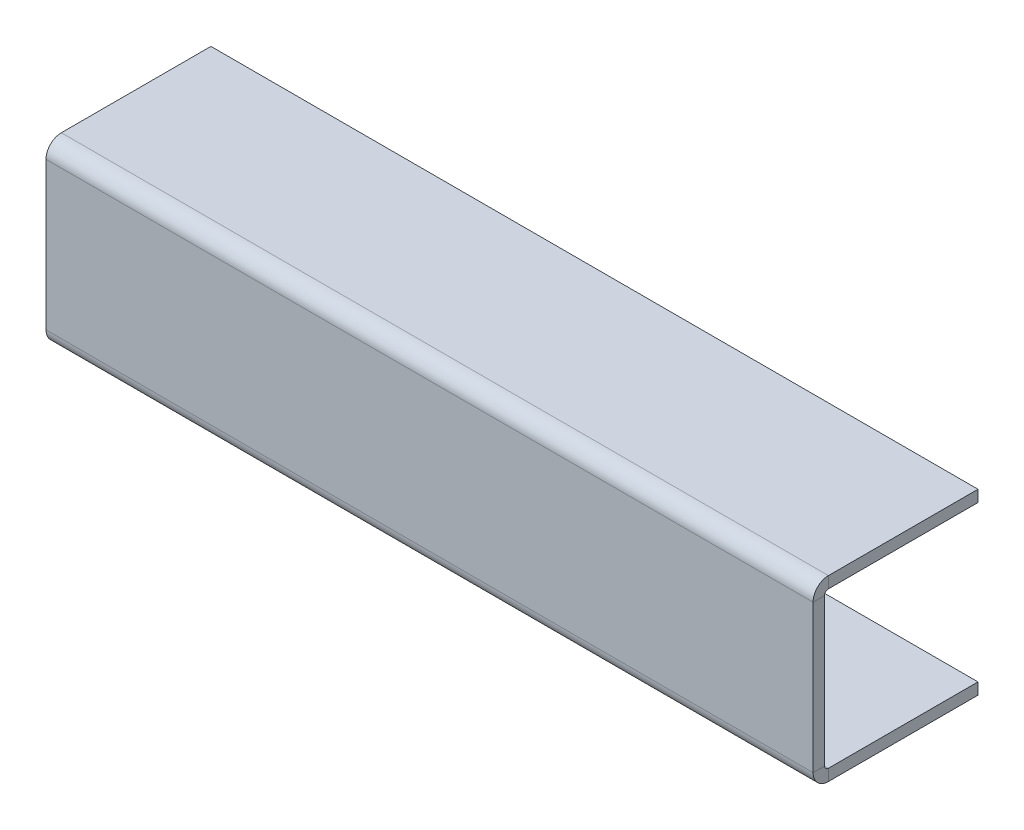
ISO-10303-21;
HEADER;
FILE_DESCRIPTION(('STEP AP214'),'2;1');
FILE_NAME('part.step','',(''),(''),'','','');
FILE_SCHEMA(('AUTOMOTIVE_DESIGN { 1 0 10303 214 1 1 1 1 }'));
ENDSEC;
DATA;
#1=APPLICATION_CONTEXT('core data for automotive mechanical design processes');
#2=APPLICATION_PROTOCOL_DEFINITION('international standard','automotive_design',2000,#1);
#3=PRODUCT_CONTEXT('',#1,'mechanical');
#4=PRODUCT('Part','Part','',(#3));
#5=PRODUCT_RELATED_PRODUCT_CATEGORY('part','',(#4));
#6=PRODUCT_DEFINITION_FORMATION('','',#4);
#7=PRODUCT_DEFINITION_CONTEXT('part definition',#1,'design');
#8=PRODUCT_DEFINITION('design','',#6,#7);
#9=PRODUCT_DEFINITION_SHAPE('','',#8);
#10=(LENGTH_UNIT() NAMED_UNIT(*) SI_UNIT(.MILLI.,.METRE.));
#11=(NAMED_UNIT(*) PLANE_ANGLE_UNIT() SI_UNIT($,.RADIAN.));
#12=(NAMED_UNIT(*) SI_UNIT($,.STERADIAN.) SOLID_ANGLE_UNIT());
#13=UNCERTAINTY_MEASURE_WITH_UNIT(LENGTH_MEASURE(1.E-05),#10,'distance_accuracy_value','');
#14=(GEOMETRIC_REPRESENTATION_CONTEXT(3) GLOBAL_UNCERTAINTY_ASSIGNED_CONTEXT((#13)) GLOBAL_UNIT_ASSIGNED_CONTEXT((#10,
#11,#12)) REPRESENTATION_CONTEXT('',''));
#15=CARTESIAN_POINT('',(0.,0.,0.));
#16=DIRECTION('',(0.,0.,1.));
#17=DIRECTION('',(1.,0.,0.));
#18=AXIS2_PLACEMENT_3D('',#15,#16,#17);
#19=CARTESIAN_POINT('',(100.,3.,3.));
#20=DIRECTION('',(1.,0.,0.));
#21=DIRECTION('',(0.,-1.,0.));
#22=AXIS2_PLACEMENT_3D('',#19,#20,#21);
#23=PLANE('',#22);
#24=DIRECTION('',(0.,0.,1.));
#25=VECTOR('',#24,1.);
#26=CARTESIAN_POINT('',(100.,-39.5,3.));
#27=LINE('',#26,#25);
#28=CARTESIAN_POINT('',(100.,-39.5,0.));
#29=VERTEX_POINT('',#28);
#30=CARTESIAN_POINT('',(100.,-39.5,3.));
#31=VERTEX_POINT('',#30);
#32=EDGE_CURVE('E11',#29,#31,#27,.T.);
#33=ORIENTED_EDGE('',*,*,#32,.F.);
#34=DIRECTION('',(0.,1.,0.));
#35=VECTOR('',#34,1.);
#36=CARTESIAN_POINT('',(100.,3.,0.));
#37=LINE('',#36,#35);
#38=CARTESIAN_POINT('',(100.,-1.,0.));
#39=VERTEX_POINT('',#38);
#40=EDGE_CURVE('E167',#39,#29,#37,.F.);
#41=ORIENTED_EDGE('',*,*,#40,.F.);
#42=DIRECTION('',(0.,0.,1.));
#43=VECTOR('',#42,1.);
#44=CARTESIAN_POINT('',(100.,-1.,3.));
#45=LINE('',#44,#43);
#46=CARTESIAN_POINT('',(100.,-1.,3.));
#47=VERTEX_POINT('',#46);
#48=EDGE_CURVE('E55',#39,#47,#45,.T.);
#49=ORIENTED_EDGE('',*,*,#48,.T.);
#50=DIRECTION('',(0.,-1.,0.));
#51=VECTOR('',#50,1.);
#52=CARTESIAN_POINT('',(100.,3.,3.));
#53=LINE('',#52,#51);
#54=EDGE_CURVE('E224',#47,#31,#53,.T.);
#55=ORIENTED_EDGE('',*,*,#54,.T.);
#56=EDGE_LOOP('',(#33,#41,#49,#55));
#57=FACE_BOUND('',#56,.T.);
#58=ADVANCED_FACE('F44',(#57),#23,.T.);
#59=CARTESIAN_POINT('',(100.,-1.,-1.));
#60=DIRECTION('',(-1.,0.,0.));
#61=DIRECTION('',(0.,0.,1.));
#62=AXIS2_PLACEMENT_3D('',#59,#60,#61);
#63=PLANE('',#62);
#64=ORIENTED_EDGE('',*,*,#48,.F.);
#65=CARTESIAN_POINT('',(100.,-1.,-1.));
#66=DIRECTION('',(-1.,0.,0.));
#67=DIRECTION('',(0.,0.,1.));
#68=AXIS2_PLACEMENT_3D('',#65,#66,#67);
#69=CIRCLE('',#68,1.);
#70=CARTESIAN_POINT('',(100.,0.,-1.));
#71=VERTEX_POINT('',#70);
#72=EDGE_CURVE('E168',#39,#71,#69,.T.);
#73=ORIENTED_EDGE('',*,*,#72,.T.);
#74=DIRECTION('',(0.,1.,0.));
#75=VECTOR('',#74,1.);
#76=CARTESIAN_POINT('',(100.,3.,-1.));
#77=LINE('',#76,#75);
#78=CARTESIAN_POINT('',(100.,3.,-1.));
#79=VERTEX_POINT('',#78);
#80=EDGE_CURVE('E216',#71,#79,#77,.T.);
#81=ORIENTED_EDGE('',*,*,#80,.T.);
#82=CARTESIAN_POINT('',(100.,-1.,-1.));
#83=DIRECTION('',(1.,0.,0.));
#84=DIRECTION('',(0.,0.,-1.));
#85=AXIS2_PLACEMENT_3D('',#82,#83,#84);
#86=CIRCLE('',#85,4.);
#87=EDGE_CURVE('E243',#47,#79,#86,.F.);
#88=ORIENTED_EDGE('',*,*,#87,.F.);
#89=EDGE_LOOP('',(#64,#73,#81,#88));
#90=FACE_BOUND('',#89,.T.);
#91=ADVANCED_FACE('F244',(#90),#63,.F.);
#92=CARTESIAN_POINT('',(100.,3.,3.));
#93=DIRECTION('',(1.,0.,0.));
#94=DIRECTION('',(0.,0.,1.));
#95=AXIS2_PLACEMENT_3D('',#92,#93,#94);
#96=PLANE('',#95);
#97=ORIENTED_EDGE('',*,*,#80,.F.);
#98=DIRECTION('',(0.,0.,-1.));
#99=VECTOR('',#98,1.);
#100=CARTESIAN_POINT('',(100.,0.,3.));
#101=LINE('',#100,#99);
#102=CARTESIAN_POINT('',(100.,0.,-40.));
#103=VERTEX_POINT('',#102);
#104=EDGE_CURVE('E176',#103,#71,#101,.F.);
#105=ORIENTED_EDGE('',*,*,#104,.F.);
#106=DIRECTION('',(0.,1.,0.));
#107=VECTOR('',#106,1.);
#108=CARTESIAN_POINT('',(100.,3.,-40.));
#109=LINE('',#108,#107);
#110=CARTESIAN_POINT('',(100.,3.,-40.));
#111=VERTEX_POINT('',#110);
#112=EDGE_CURVE('E212',#103,#111,#109,.T.);
#113=ORIENTED_EDGE('',*,*,#112,.T.);
#114=DIRECTION('',(0.,0.,1.));
#115=VECTOR('',#114,1.);
#116=CARTESIAN_POINT('',(100.,3.,3.));
#117=LINE('',#116,#115);
#118=EDGE_CURVE('E297',#111,#79,#117,.T.);
#119=ORIENTED_EDGE('',*,*,#118,.T.);
#120=EDGE_LOOP('',(#97,#105,#113,#119));
#121=FACE_BOUND('',#120,.T.);
#122=ADVANCED_FACE('F295',(#121),#96,.T.);
#123=CARTESIAN_POINT('',(100.,3.,-40.));
#124=DIRECTION('',(0.,0.,1.));
#125=DIRECTION('',(-1.,0.,0.));
#126=AXIS2_PLACEMENT_3D('',#123,#124,#125);
#127=PLANE('',#126);
#128=ORIENTED_EDGE('',*,*,#112,.F.);
#129=DIRECTION('',(1.,0.,0.));
#130=VECTOR('',#129,1.);
#131=CARTESIAN_POINT('',(100.,0.,-40.));
#132=LINE('',#131,#130);
#133=CARTESIAN_POINT('',(-100.,0.,-40.));
#134=VERTEX_POINT('',#133);
#135=EDGE_CURVE('E161',#103,#134,#132,.F.);
#136=ORIENTED_EDGE('',*,*,#135,.T.);
#137=DIRECTION('',(0.,1.,0.));
#138=VECTOR('',#137,1.);
#139=CARTESIAN_POINT('',(-100.,3.,-40.));
#140=LINE('',#139,#138);
#141=CARTESIAN_POINT('',(-100.,3.,-40.));
#142=VERTEX_POINT('',#141);
#143=EDGE_CURVE('E208',#134,#142,#140,.T.);
#144=ORIENTED_EDGE('',*,*,#143,.T.);
#145=DIRECTION('',(-1.,0.,0.));
#146=VECTOR('',#145,1.);
#147=CARTESIAN_POINT('',(100.,3.,-40.));
#148=LINE('',#147,#146);
#149=EDGE_CURVE('E304',#111,#142,#148,.T.);
#150=ORIENTED_EDGE('',*,*,#149,.F.);
#151=EDGE_LOOP('',(#128,#136,#144,#150));
#152=FACE_BOUND('',#151,.T.);
#153=ADVANCED_FACE('F339',(#152),#127,.F.);
#154=CARTESIAN_POINT('',(-100.,3.,3.));
#155=DIRECTION('',(1.,0.,0.));
#156=DIRECTION('',(0.,0.,1.));
#157=AXIS2_PLACEMENT_3D('',#154,#155,#156);
#158=PLANE('',#157);
#159=ORIENTED_EDGE('',*,*,#143,.F.);
#160=DIRECTION('',(0.,0.,-1.));
#161=VECTOR('',#160,1.);
#162=CARTESIAN_POINT('',(-100.,0.,3.));
#163=LINE('',#162,#161);
#164=CARTESIAN_POINT('',(-100.,0.,-1.));
#165=VERTEX_POINT('',#164);
#166=EDGE_CURVE('E172',#134,#165,#163,.F.);
#167=ORIENTED_EDGE('',*,*,#166,.T.);
#168=DIRECTION('',(0.,1.,0.));
#169=VECTOR('',#168,1.);
#170=CARTESIAN_POINT('',(-100.,3.,-1.));
#171=LINE('',#170,#169);
#172=CARTESIAN_POINT('',(-100.,3.,-1.));
#173=VERTEX_POINT('',#172);
#174=EDGE_CURVE('E204',#165,#173,#171,.T.);
#175=ORIENTED_EDGE('',*,*,#174,.T.);
#176=DIRECTION('',(0.,0.,1.));
#177=VECTOR('',#176,1.);
#178=CARTESIAN_POINT('',(-100.,3.,3.));
#179=LINE('',#178,#177);
#180=EDGE_CURVE('E239',#142,#173,#179,.T.);
#181=ORIENTED_EDGE('',*,*,#180,.F.);
#182=EDGE_LOOP('',(#159,#167,#175,#181));
#183=FACE_BOUND('',#182,.T.);
#184=ADVANCED_FACE('F342',(#183),#158,.F.);
#185=CARTESIAN_POINT('',(-100.,-1.,-1.));
#186=DIRECTION('',(1.,0.,0.));
#187=DIRECTION('',(0.,0.,-1.));
#188=AXIS2_PLACEMENT_3D('',#185,#186,#187);
#189=PLANE('',#188);
#190=ORIENTED_EDGE('',*,*,#174,.F.);
#191=CARTESIAN_POINT('',(-100.,-1.,-1.));
#192=DIRECTION('',(-1.,0.,0.));
#193=DIRECTION('',(0.,0.,1.));
#194=AXIS2_PLACEMENT_3D('',#191,#192,#193);
#195=CIRCLE('',#194,1.);
#196=CARTESIAN_POINT('',(-100.,-1.,0.));
#197=VERTEX_POINT('',#196);
#198=EDGE_CURVE('E142',#165,#197,#195,.F.);
#199=ORIENTED_EDGE('',*,*,#198,.T.);
#200=DIRECTION('',(0.,0.,1.));
#201=VECTOR('',#200,1.);
#202=CARTESIAN_POINT('',(-100.,-1.,3.));
#203=LINE('',#202,#201);
#204=CARTESIAN_POINT('',(-100.,-1.,3.));
#205=VERTEX_POINT('',#204);
#206=EDGE_CURVE('E200',#197,#205,#203,.T.);
#207=ORIENTED_EDGE('',*,*,#206,.T.);
#208=CARTESIAN_POINT('',(-100.,-1.,-1.));
#209=DIRECTION('',(-1.,0.,0.));
#210=DIRECTION('',(0.,0.,1.));
#211=AXIS2_PLACEMENT_3D('',#208,#209,#210);
#212=CIRCLE('',#211,4.);
#213=EDGE_CURVE('E250',#173,#205,#212,.F.);
#214=ORIENTED_EDGE('',*,*,#213,.F.);
#215=EDGE_LOOP('',(#190,#199,#207,#214));
#216=FACE_BOUND('',#215,.T.);
#217=ADVANCED_FACE('F368',(#216),#189,.F.);
#218=CARTESIAN_POINT('',(-100.,3.,3.));
#219=DIRECTION('',(1.,0.,0.));
#220=DIRECTION('',(0.,-1.,0.));
#221=AXIS2_PLACEMENT_3D('',#218,#219,#220);
#222=PLANE('',#221);
#223=ORIENTED_EDGE('',*,*,#206,.F.);
#224=DIRECTION('',(0.,1.,0.));
#225=VECTOR('',#224,1.);
#226=CARTESIAN_POINT('',(-100.,3.,0.));
#227=LINE('',#226,#225);
#228=CARTESIAN_POINT('',(-100.,-39.5,0.));
#229=VERTEX_POINT('',#228);
#230=EDGE_CURVE('E164',#197,#229,#227,.F.);
#231=ORIENTED_EDGE('',*,*,#230,.T.);
#232=DIRECTION('',(0.,0.,1.));
#233=VECTOR('',#232,1.);
#234=CARTESIAN_POINT('',(-100.,-39.5,3.));
#235=LINE('',#234,#233);
#236=CARTESIAN_POINT('',(-100.,-39.5,3.));
#237=VERTEX_POINT('',#236);
#238=EDGE_CURVE('E63',#229,#237,#235,.T.);
#239=ORIENTED_EDGE('',*,*,#238,.T.);
#240=DIRECTION('',(0.,-1.,0.));
#241=VECTOR('',#240,1.);
#242=CARTESIAN_POINT('',(-100.,3.,3.));
#243=LINE('',#242,#241);
#244=EDGE_CURVE('E240',#205,#237,#243,.T.);
#245=ORIENTED_EDGE('',*,*,#244,.F.);
#246=EDGE_LOOP('',(#223,#231,#239,#245));
#247=FACE_BOUND('',#246,.T.);
#248=ADVANCED_FACE('F371',(#247),#222,.F.);
#249=CARTESIAN_POINT('',(-100.,-39.5,-1.));
#250=DIRECTION('',(1.,0.,0.));
#251=DIRECTION('',(0.,0.,-1.));
#252=AXIS2_PLACEMENT_3D('',#249,#250,#251);
#253=PLANE('',#252);
#254=ORIENTED_EDGE('',*,*,#238,.F.);
#255=CARTESIAN_POINT('',(-100.,-39.5,-1.));
#256=DIRECTION('',(-1.,0.,0.));
#257=DIRECTION('',(0.,0.,1.));
#258=AXIS2_PLACEMENT_3D('',#255,#256,#257);
#259=CIRCLE('',#258,1.);
#260=CARTESIAN_POINT('',(-100.,-40.5,-1.));
#261=VERTEX_POINT('',#260);
#262=EDGE_CURVE('E143',#229,#261,#259,.F.);
#263=ORIENTED_EDGE('',*,*,#262,.T.);
#264=DIRECTION('',(0.,-1.,0.));
#265=VECTOR('',#264,1.);
#266=CARTESIAN_POINT('',(-100.,-43.5,-1.));
#267=LINE('',#266,#265);
#268=CARTESIAN_POINT('',(-100.,-43.5,-1.));
#269=VERTEX_POINT('',#268);
#270=EDGE_CURVE('E194',#261,#269,#267,.T.);
#271=ORIENTED_EDGE('',*,*,#270,.T.);
#272=CARTESIAN_POINT('',(-100.,-39.5,-1.));
#273=DIRECTION('',(-1.,0.,0.));
#274=DIRECTION('',(0.,0.,1.));
#275=AXIS2_PLACEMENT_3D('',#272,#273,#274);
#276=CIRCLE('',#275,4.);
#277=EDGE_CURVE('E275',#237,#269,#276,.F.);
#278=ORIENTED_EDGE('',*,*,#277,.F.);
#279=EDGE_LOOP('',(#254,#263,#271,#278));
#280=FACE_BOUND('',#279,.T.);
#281=ADVANCED_FACE('F315',(#280),#253,.F.);
#282=CARTESIAN_POINT('',(-100.,-43.5,2.99999999999999));
#283=DIRECTION('',(1.,0.,0.));
#284=DIRECTION('',(0.,0.,-1.));
#285=AXIS2_PLACEMENT_3D('',#282,#283,#284);
#286=PLANE('',#285);
#287=ORIENTED_EDGE('',*,*,#270,.F.);
#288=DIRECTION('',(0.,0.,1.));
#289=VECTOR('',#288,1.);
#290=CARTESIAN_POINT('',(-100.,-40.5,2.99999999999999));
#291=LINE('',#290,#289);
#292=CARTESIAN_POINT('',(-100.,-40.5,-40.));
#293=VERTEX_POINT('',#292);
#294=EDGE_CURVE('E130',#261,#293,#291,.F.);
#295=ORIENTED_EDGE('',*,*,#294,.T.);
#296=DIRECTION('',(0.,-1.,0.));
#297=VECTOR('',#296,1.);
#298=CARTESIAN_POINT('',(-100.,-43.5,-40.));
#299=LINE('',#298,#297);
#300=CARTESIAN_POINT('',(-100.,-43.5,-40.));
#301=VERTEX_POINT('',#300);
#302=EDGE_CURVE('E190',#293,#301,#299,.T.);
#303=ORIENTED_EDGE('',*,*,#302,.T.);
#304=DIRECTION('',(0.,0.,-1.));
#305=VECTOR('',#304,1.);
#306=CARTESIAN_POINT('',(-100.,-43.5,2.99999999999999));
#307=LINE('',#306,#305);
#308=EDGE_CURVE('E322',#269,#301,#307,.T.);
#309=ORIENTED_EDGE('',*,*,#308,.F.);
#310=EDGE_LOOP('',(#287,#295,#303,#309));
#311=FACE_BOUND('',#310,.T.);
#312=ADVANCED_FACE('F323',(#311),#286,.F.);
#313=CARTESIAN_POINT('',(100.,-43.5,-40.));
#314=DIRECTION('',(0.,0.,-1.));
#315=DIRECTION('',(-1.,0.,0.));
#316=AXIS2_PLACEMENT_3D('',#313,#314,#315);
#317=PLANE('',#316);
#318=ORIENTED_EDGE('',*,*,#302,.F.);
#319=DIRECTION('',(1.,0.,0.));
#320=VECTOR('',#319,1.);
#321=CARTESIAN_POINT('',(100.,-40.5,-40.));
#322=LINE('',#321,#320);
#323=CARTESIAN_POINT('',(100.,-40.5,-40.));
#324=VERTEX_POINT('',#323);
#325=EDGE_CURVE('E150',#324,#293,#322,.F.);
#326=ORIENTED_EDGE('',*,*,#325,.F.);
#327=DIRECTION('',(0.,-1.,0.));
#328=VECTOR('',#327,1.);
#329=CARTESIAN_POINT('',(100.,-43.5,-40.));
#330=LINE('',#329,#328);
#331=CARTESIAN_POINT('',(100.,-43.5,-40.));
#332=VERTEX_POINT('',#331);
#333=EDGE_CURVE('E119',#324,#332,#330,.T.);
#334=ORIENTED_EDGE('',*,*,#333,.T.);
#335=DIRECTION('',(-1.,0.,0.));
#336=VECTOR('',#335,1.);
#337=CARTESIAN_POINT('',(100.,-43.5,-40.));
#338=LINE('',#337,#336);
#339=EDGE_CURVE('E264',#332,#301,#338,.T.);
#340=ORIENTED_EDGE('',*,*,#339,.T.);
#341=EDGE_LOOP('',(#318,#326,#334,#340));
#342=FACE_BOUND('',#341,.T.);
#343=ADVANCED_FACE('F347',(#342),#317,.T.);
#344=CARTESIAN_POINT('',(100.,-43.5,2.99999999999999));
#345=DIRECTION('',(1.,0.,0.));
#346=DIRECTION('',(0.,0.,-1.));
#347=AXIS2_PLACEMENT_3D('',#344,#345,#346);
#348=PLANE('',#347);
#349=ORIENTED_EDGE('',*,*,#333,.F.);
#350=DIRECTION('',(0.,0.,1.));
#351=VECTOR('',#350,1.);
#352=CARTESIAN_POINT('',(100.,-40.5,2.99999999999999));
#353=LINE('',#352,#351);
#354=CARTESIAN_POINT('',(100.,-40.5,-1.));
#355=VERTEX_POINT('',#354);
#356=EDGE_CURVE('E128',#355,#324,#353,.F.);
#357=ORIENTED_EDGE('',*,*,#356,.F.);
#358=DIRECTION('',(0.,-1.,0.));
#359=VECTOR('',#358,1.);
#360=CARTESIAN_POINT('',(100.,-43.5,-1.));
#361=LINE('',#360,#359);
#362=CARTESIAN_POINT('',(100.,-43.5,-1.));
#363=VERTEX_POINT('',#362);
#364=EDGE_CURVE('E48',#355,#363,#361,.T.);
#365=ORIENTED_EDGE('',*,*,#364,.T.);
#366=DIRECTION('',(0.,0.,-1.));
#367=VECTOR('',#366,1.);
#368=CARTESIAN_POINT('',(100.,-43.5,2.99999999999999));
#369=LINE('',#368,#367);
#370=EDGE_CURVE('E257',#363,#332,#369,.T.);
#371=ORIENTED_EDGE('',*,*,#370,.T.);
#372=EDGE_LOOP('',(#349,#357,#365,#371));
#373=FACE_BOUND('',#372,.T.);
#374=ADVANCED_FACE('F145',(#373),#348,.T.);
#375=CARTESIAN_POINT('',(100.,-39.5,-1.));
#376=DIRECTION('',(-1.,0.,0.));
#377=DIRECTION('',(0.,0.,1.));
#378=AXIS2_PLACEMENT_3D('',#375,#376,#377);
#379=PLANE('',#378);
#380=CARTESIAN_POINT('',(100.,-39.5,-1.));
#381=DIRECTION('',(-1.,0.,0.));
#382=DIRECTION('',(0.,0.,1.));
#383=AXIS2_PLACEMENT_3D('',#380,#381,#382);
#384=CIRCLE('',#383,1.);
#385=EDGE_CURVE('E111',#355,#29,#384,.T.);
#386=ORIENTED_EDGE('',*,*,#385,.T.);
#387=ORIENTED_EDGE('',*,*,#32,.T.);
#388=CARTESIAN_POINT('',(100.,-39.5,-1.));
#389=DIRECTION('',(1.,0.,0.));
#390=DIRECTION('',(0.,0.,-1.));
#391=AXIS2_PLACEMENT_3D('',#388,#389,#390);
#392=CIRCLE('',#391,4.);
#393=EDGE_CURVE('E113',#363,#31,#392,.F.);
#394=ORIENTED_EDGE('',*,*,#393,.F.);
#395=ORIENTED_EDGE('',*,*,#364,.F.);
#396=EDGE_LOOP('',(#386,#387,#394,#395));
#397=FACE_BOUND('',#396,.T.);
#398=ADVANCED_FACE('F46',(#397),#379,.F.);
#399=CARTESIAN_POINT('',(100.,-43.5,2.99999999999999));
#400=DIRECTION('',(0.,1.,0.));
#401=DIRECTION('',(0.,0.,1.));
#402=AXIS2_PLACEMENT_3D('',#399,#400,#401);
#403=PLANE('',#402);
#404=ORIENTED_EDGE('',*,*,#370,.F.);
#405=DIRECTION('',(-1.,0.,0.));
#406=VECTOR('',#405,1.);
#407=CARTESIAN_POINT('',(100.,-43.5,-1.));
#408=LINE('',#407,#406);
#409=EDGE_CURVE('E262',#363,#269,#408,.T.);
#410=ORIENTED_EDGE('',*,*,#409,.T.);
#411=ORIENTED_EDGE('',*,*,#308,.T.);
#412=ORIENTED_EDGE('',*,*,#339,.F.);
#413=EDGE_LOOP('',(#404,#410,#411,#412));
#414=FACE_BOUND('',#413,.T.);
#415=ADVANCED_FACE('F330',(#414),#403,.F.);
#416=CARTESIAN_POINT('',(100.,3.,3.));
#417=DIRECTION('',(0.,-1.,0.));
#418=DIRECTION('',(0.,0.,-1.));
#419=AXIS2_PLACEMENT_3D('',#416,#417,#418);
#420=PLANE('',#419);
#421=ORIENTED_EDGE('',*,*,#180,.T.);
#422=DIRECTION('',(-1.,0.,0.));
#423=VECTOR('',#422,1.);
#424=CARTESIAN_POINT('',(100.,3.,-1.));
#425=LINE('',#424,#423);
#426=EDGE_CURVE('E256',#173,#79,#425,.F.);
#427=ORIENTED_EDGE('',*,*,#426,.T.);
#428=ORIENTED_EDGE('',*,*,#118,.F.);
#429=ORIENTED_EDGE('',*,*,#149,.T.);
#430=EDGE_LOOP('',(#421,#427,#428,#429));
#431=FACE_BOUND('',#430,.T.);
#432=ADVANCED_FACE('F307',(#431),#420,.F.);
#433=CARTESIAN_POINT('',(100.,3.,3.));
#434=DIRECTION('',(0.,0.,-1.));
#435=DIRECTION('',(0.,1.,0.));
#436=AXIS2_PLACEMENT_3D('',#433,#434,#435);
#437=PLANE('',#436);
#438=ORIENTED_EDGE('',*,*,#244,.T.);
#439=DIRECTION('',(-1.,0.,0.));
#440=VECTOR('',#439,1.);
#441=CARTESIAN_POINT('',(100.,-39.5,3.));
#442=LINE('',#441,#440);
#443=EDGE_CURVE('E120',#237,#31,#442,.F.);
#444=ORIENTED_EDGE('',*,*,#443,.T.);
#445=ORIENTED_EDGE('',*,*,#54,.F.);
#446=DIRECTION('',(-1.,0.,0.));
#447=VECTOR('',#446,1.);
#448=CARTESIAN_POINT('',(100.,-1.,3.));
#449=LINE('',#448,#447);
#450=EDGE_CURVE('E236',#47,#205,#449,.T.);
#451=ORIENTED_EDGE('',*,*,#450,.T.);
#452=EDGE_LOOP('',(#438,#444,#445,#451));
#453=FACE_BOUND('',#452,.T.);
#454=ADVANCED_FACE('F234',(#453),#437,.F.);
#455=CARTESIAN_POINT('',(100.,-1.,-1.));
#456=DIRECTION('',(-1.,0.,0.));
#457=DIRECTION('',(0.,0.,1.));
#458=AXIS2_PLACEMENT_3D('',#455,#456,#457);
#459=CYLINDRICAL_SURFACE('',#458,4.);
#460=ORIENTED_EDGE('',*,*,#87,.T.);
#461=ORIENTED_EDGE('',*,*,#426,.F.);
#462=ORIENTED_EDGE('',*,*,#213,.T.);
#463=ORIENTED_EDGE('',*,*,#450,.F.);
#464=EDGE_LOOP('',(#460,#461,#462,#463));
#465=FACE_BOUND('',#464,.T.);
#466=ADVANCED_FACE('F253',(#465),#459,.T.);
#467=CARTESIAN_POINT('',(100.,-39.5,-1.));
#468=DIRECTION('',(-1.,0.,0.));
#469=DIRECTION('',(0.,0.,1.));
#470=AXIS2_PLACEMENT_3D('',#467,#468,#469);
#471=CYLINDRICAL_SURFACE('',#470,4.);
#472=ORIENTED_EDGE('',*,*,#393,.T.);
#473=ORIENTED_EDGE('',*,*,#443,.F.);
#474=ORIENTED_EDGE('',*,*,#277,.T.);
#475=ORIENTED_EDGE('',*,*,#409,.F.);
#476=EDGE_LOOP('',(#472,#473,#474,#475));
#477=FACE_BOUND('',#476,.T.);
#478=ADVANCED_FACE('F320',(#477),#471,.T.);
#479=CARTESIAN_POINT('',(100.,-40.5,2.99999999999999));
#480=DIRECTION('',(0.,1.,0.));
#481=DIRECTION('',(0.,0.,1.));
#482=AXIS2_PLACEMENT_3D('',#479,#480,#481);
#483=PLANE('',#482);
#484=ORIENTED_EDGE('',*,*,#356,.T.);
#485=ORIENTED_EDGE('',*,*,#325,.T.);
#486=ORIENTED_EDGE('',*,*,#294,.F.);
#487=DIRECTION('',(1.,0.,0.));
#488=VECTOR('',#487,1.);
#489=CARTESIAN_POINT('',(100.,-40.5,-1.));
#490=LINE('',#489,#488);
#491=EDGE_CURVE('E125',#355,#261,#490,.F.);
#492=ORIENTED_EDGE('',*,*,#491,.F.);
#493=EDGE_LOOP('',(#484,#485,#486,#492));
#494=FACE_BOUND('',#493,.T.);
#495=ADVANCED_FACE('F126',(#494),#483,.T.);
#496=CARTESIAN_POINT('',(100.,0.,3.));
#497=DIRECTION('',(0.,-1.,0.));
#498=DIRECTION('',(0.,0.,-1.));
#499=AXIS2_PLACEMENT_3D('',#496,#497,#498);
#500=PLANE('',#499);
#501=ORIENTED_EDGE('',*,*,#166,.F.);
#502=ORIENTED_EDGE('',*,*,#135,.F.);
#503=ORIENTED_EDGE('',*,*,#104,.T.);
#504=DIRECTION('',(1.,0.,0.));
#505=VECTOR('',#504,1.);
#506=CARTESIAN_POINT('',(100.,0.,-1.));
#507=LINE('',#506,#505);
#508=EDGE_CURVE('E136',#165,#71,#507,.T.);
#509=ORIENTED_EDGE('',*,*,#508,.F.);
#510=EDGE_LOOP('',(#501,#502,#503,#509));
#511=FACE_BOUND('',#510,.T.);
#512=ADVANCED_FACE('F293',(#511),#500,.T.);
#513=CARTESIAN_POINT('',(100.,3.,0.));
#514=DIRECTION('',(0.,0.,-1.));
#515=DIRECTION('',(0.,1.,0.));
#516=AXIS2_PLACEMENT_3D('',#513,#514,#515);
#517=PLANE('',#516);
#518=ORIENTED_EDGE('',*,*,#230,.F.);
#519=DIRECTION('',(1.,0.,0.));
#520=VECTOR('',#519,1.);
#521=CARTESIAN_POINT('',(100.,-1.,0.));
#522=LINE('',#521,#520);
#523=EDGE_CURVE('E149',#39,#197,#522,.F.);
#524=ORIENTED_EDGE('',*,*,#523,.F.);
#525=ORIENTED_EDGE('',*,*,#40,.T.);
#526=DIRECTION('',(1.,0.,0.));
#527=VECTOR('',#526,1.);
#528=CARTESIAN_POINT('',(100.,-39.5,0.));
#529=LINE('',#528,#527);
#530=EDGE_CURVE('E135',#229,#29,#529,.T.);
#531=ORIENTED_EDGE('',*,*,#530,.F.);
#532=EDGE_LOOP('',(#518,#524,#525,#531));
#533=FACE_BOUND('',#532,.T.);
#534=ADVANCED_FACE('F416',(#533),#517,.T.);
#535=CARTESIAN_POINT('',(100.,-1.,-1.));
#536=DIRECTION('',(-1.,0.,0.));
#537=DIRECTION('',(0.,0.,1.));
#538=AXIS2_PLACEMENT_3D('',#535,#536,#537);
#539=CYLINDRICAL_SURFACE('',#538,1.);
#540=ORIENTED_EDGE('',*,*,#72,.F.);
#541=ORIENTED_EDGE('',*,*,#523,.T.);
#542=ORIENTED_EDGE('',*,*,#198,.F.);
#543=ORIENTED_EDGE('',*,*,#508,.T.);
#544=EDGE_LOOP('',(#540,#541,#542,#543));
#545=FACE_BOUND('',#544,.T.);
#546=ADVANCED_FACE('F288',(#545),#539,.F.);
#547=CARTESIAN_POINT('',(100.,-39.5,-1.));
#548=DIRECTION('',(-1.,0.,0.));
#549=DIRECTION('',(0.,0.,1.));
#550=AXIS2_PLACEMENT_3D('',#547,#548,#549);
#551=CYLINDRICAL_SURFACE('',#550,1.);
#552=ORIENTED_EDGE('',*,*,#385,.F.);
#553=ORIENTED_EDGE('',*,*,#491,.T.);
#554=ORIENTED_EDGE('',*,*,#262,.F.);
#555=ORIENTED_EDGE('',*,*,#530,.T.);
#556=EDGE_LOOP('',(#552,#553,#554,#555));
#557=FACE_BOUND('',#556,.T.);
#558=ADVANCED_FACE('F138',(#557),#551,.F.);
#559=CLOSED_SHELL('',(#58,#91,#122,#153,#184,#217,#248,#281,#312,#343,#374,#398,#415,#432,#454,
#466,#478,#495,#512,#534,#546,#558));
#560=MANIFOLD_SOLID_BREP('B2',#559);
#561=ADVANCED_BREP_SHAPE_REPRESENTATION('',(#18,#560),#14);
#562=SHAPE_DEFINITION_REPRESENTATION(#9,#561);
ENDSEC;
END-ISO-10303-21;
